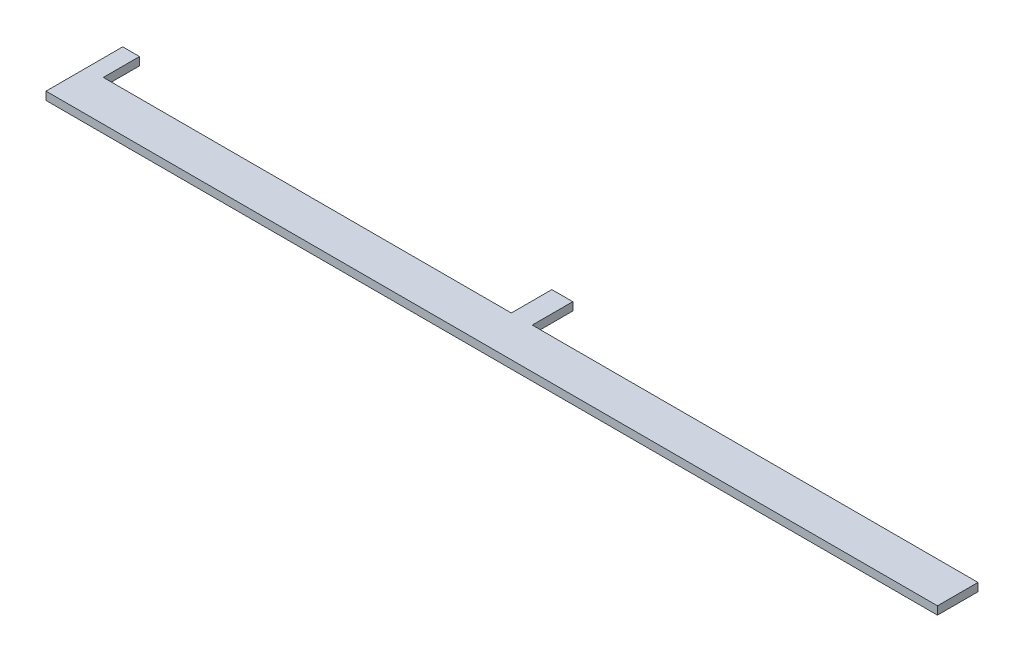
ISO-10303-21;
HEADER;
FILE_DESCRIPTION(('STEP AP214'),'2;1');
FILE_NAME('part.step','',(''),(''),'','','');
FILE_SCHEMA(('AUTOMOTIVE_DESIGN { 1 0 10303 214 1 1 1 1 }'));
ENDSEC;
DATA;
#1=APPLICATION_CONTEXT('core data for automotive mechanical design processes');
#2=APPLICATION_PROTOCOL_DEFINITION('international standard','automotive_design',2000,#1);
#3=PRODUCT_CONTEXT('',#1,'mechanical');
#4=PRODUCT('Part','Part','',(#3));
#5=PRODUCT_RELATED_PRODUCT_CATEGORY('part','',(#4));
#6=PRODUCT_DEFINITION_FORMATION('','',#4);
#7=PRODUCT_DEFINITION_CONTEXT('part definition',#1,'design');
#8=PRODUCT_DEFINITION('design','',#6,#7);
#9=PRODUCT_DEFINITION_SHAPE('','',#8);
#10=(LENGTH_UNIT() NAMED_UNIT(*) SI_UNIT(.MILLI.,.METRE.));
#11=(NAMED_UNIT(*) PLANE_ANGLE_UNIT() SI_UNIT($,.RADIAN.));
#12=(NAMED_UNIT(*) SI_UNIT($,.STERADIAN.) SOLID_ANGLE_UNIT());
#13=UNCERTAINTY_MEASURE_WITH_UNIT(LENGTH_MEASURE(1.E-05),#10,'distance_accuracy_value','');
#14=(GEOMETRIC_REPRESENTATION_CONTEXT(3) GLOBAL_UNCERTAINTY_ASSIGNED_CONTEXT((#13)) GLOBAL_UNIT_ASSIGNED_CONTEXT((#10,
#11,#12)) REPRESENTATION_CONTEXT('',''));
#15=CARTESIAN_POINT('',(0.,0.,0.));
#16=DIRECTION('',(0.,0.,1.));
#17=DIRECTION('',(1.,0.,0.));
#18=AXIS2_PLACEMENT_3D('',#15,#16,#17);
#19=CARTESIAN_POINT('',(-110.,2.,5.00000000000002));
#20=DIRECTION('',(1.,0.,0.));
#21=DIRECTION('',(0.,0.,-1.));
#22=AXIS2_PLACEMENT_3D('',#19,#20,#21);
#23=PLANE('',#22);
#24=DIRECTION('',(0.,0.,1.));
#25=VECTOR('',#24,1.);
#26=CARTESIAN_POINT('',(-110.,0.,5.00000000000002));
#27=LINE('',#26,#25);
#28=CARTESIAN_POINT('',(-110.,0.,-13.9308609903992));
#29=VERTEX_POINT('',#28);
#30=CARTESIAN_POINT('',(-110.,0.,5.00000000000002));
#31=VERTEX_POINT('',#30);
#32=EDGE_CURVE('E92',#29,#31,#27,.T.);
#33=ORIENTED_EDGE('',*,*,#32,.T.);
#34=DIRECTION('',(0.,-1.,0.));
#35=VECTOR('',#34,1.);
#36=CARTESIAN_POINT('',(-110.,2.,5.00000000000002));
#37=LINE('',#36,#35);
#38=CARTESIAN_POINT('',(-110.,2.,5.00000000000002));
#39=VERTEX_POINT('',#38);
#40=EDGE_CURVE('E11',#39,#31,#37,.T.);
#41=ORIENTED_EDGE('',*,*,#40,.F.);
#42=DIRECTION('',(0.,0.,1.));
#43=VECTOR('',#42,1.);
#44=CARTESIAN_POINT('',(-110.,2.,-4.99999999999999));
#45=LINE('',#44,#43);
#46=CARTESIAN_POINT('',(-110.,2.,-13.9308609903992));
#47=VERTEX_POINT('',#46);
#48=EDGE_CURVE('E98',#47,#39,#45,.T.);
#49=ORIENTED_EDGE('',*,*,#48,.F.);
#50=DIRECTION('',(0.,-1.,0.));
#51=VECTOR('',#50,1.);
#52=CARTESIAN_POINT('',(-110.,2.,-13.9308609903992));
#53=LINE('',#52,#51);
#54=EDGE_CURVE('E138',#47,#29,#53,.T.);
#55=ORIENTED_EDGE('',*,*,#54,.T.);
#56=EDGE_LOOP('',(#33,#41,#49,#55));
#57=FACE_BOUND('',#56,.T.);
#58=ADVANCED_FACE('F34',(#57),#23,.F.);
#59=CARTESIAN_POINT('',(110.,2.,4.99999999999999));
#60=DIRECTION('',(0.,0.,-1.));
#61=DIRECTION('',(-1.,0.,0.));
#62=AXIS2_PLACEMENT_3D('',#59,#60,#61);
#63=PLANE('',#62);
#64=DIRECTION('',(1.,0.,0.));
#65=VECTOR('',#64,1.);
#66=CARTESIAN_POINT('',(110.,0.,4.99999999999999));
#67=LINE('',#66,#65);
#68=CARTESIAN_POINT('',(110.,0.,4.99999999999999));
#69=VERTEX_POINT('',#68);
#70=EDGE_CURVE('E143',#31,#69,#67,.T.);
#71=ORIENTED_EDGE('',*,*,#70,.T.);
#72=DIRECTION('',(0.,-1.,0.));
#73=VECTOR('',#72,1.);
#74=CARTESIAN_POINT('',(110.,2.,4.99999999999999));
#75=LINE('',#74,#73);
#76=CARTESIAN_POINT('',(110.,2.,4.99999999999999));
#77=VERTEX_POINT('',#76);
#78=EDGE_CURVE('E42',#77,#69,#75,.T.);
#79=ORIENTED_EDGE('',*,*,#78,.F.);
#80=DIRECTION('',(1.,0.,0.));
#81=VECTOR('',#80,1.);
#82=CARTESIAN_POINT('',(110.,2.,4.99999999999999));
#83=LINE('',#82,#81);
#84=EDGE_CURVE('E205',#39,#77,#83,.T.);
#85=ORIENTED_EDGE('',*,*,#84,.F.);
#86=ORIENTED_EDGE('',*,*,#40,.T.);
#87=EDGE_LOOP('',(#71,#79,#85,#86));
#88=FACE_BOUND('',#87,.T.);
#89=ADVANCED_FACE('F207',(#88),#63,.F.);
#90=CARTESIAN_POINT('',(110.,2.,4.99999999999999));
#91=DIRECTION('',(-1.,0.,0.));
#92=DIRECTION('',(0.,0.,1.));
#93=AXIS2_PLACEMENT_3D('',#90,#91,#92);
#94=PLANE('',#93);
#95=DIRECTION('',(0.,0.,-1.));
#96=VECTOR('',#95,1.);
#97=CARTESIAN_POINT('',(110.,0.,4.99999999999999));
#98=LINE('',#97,#96);
#99=CARTESIAN_POINT('',(110.,0.,-5.00000000000001));
#100=VERTEX_POINT('',#99);
#101=EDGE_CURVE('E145',#69,#100,#98,.T.);
#102=ORIENTED_EDGE('',*,*,#101,.T.);
#103=DIRECTION('',(0.,-1.,0.));
#104=VECTOR('',#103,1.);
#105=CARTESIAN_POINT('',(110.,2.,-5.00000000000001));
#106=LINE('',#105,#104);
#107=CARTESIAN_POINT('',(110.,2.,-5.00000000000001));
#108=VERTEX_POINT('',#107);
#109=EDGE_CURVE('E172',#108,#100,#106,.T.);
#110=ORIENTED_EDGE('',*,*,#109,.F.);
#111=DIRECTION('',(0.,0.,-1.));
#112=VECTOR('',#111,1.);
#113=CARTESIAN_POINT('',(110.,2.,4.99999999999999));
#114=LINE('',#113,#112);
#115=EDGE_CURVE('E181',#77,#108,#114,.T.);
#116=ORIENTED_EDGE('',*,*,#115,.F.);
#117=ORIENTED_EDGE('',*,*,#78,.T.);
#118=EDGE_LOOP('',(#102,#110,#116,#117));
#119=FACE_BOUND('',#118,.T.);
#120=ADVANCED_FACE('F179',(#119),#94,.F.);
#121=CARTESIAN_POINT('',(110.,2.,-5.00000000000001));
#122=DIRECTION('',(0.,0.,1.));
#123=DIRECTION('',(1.,0.,0.));
#124=AXIS2_PLACEMENT_3D('',#121,#122,#123);
#125=PLANE('',#124);
#126=DIRECTION('',(-1.,0.,0.));
#127=VECTOR('',#126,1.);
#128=CARTESIAN_POINT('',(110.,0.,-5.00000000000001));
#129=LINE('',#128,#127);
#130=CARTESIAN_POINT('',(0.,0.,-5.));
#131=VERTEX_POINT('',#130);
#132=EDGE_CURVE('E147',#100,#131,#129,.T.);
#133=ORIENTED_EDGE('',*,*,#132,.T.);
#134=DIRECTION('',(0.,-1.,0.));
#135=VECTOR('',#134,1.);
#136=CARTESIAN_POINT('',(0.,2.,-5.));
#137=LINE('',#136,#135);
#138=CARTESIAN_POINT('',(0.,2.,-5.));
#139=VERTEX_POINT('',#138);
#140=EDGE_CURVE('E169',#139,#131,#137,.T.);
#141=ORIENTED_EDGE('',*,*,#140,.F.);
#142=DIRECTION('',(-1.,0.,0.));
#143=VECTOR('',#142,1.);
#144=CARTESIAN_POINT('',(110.,2.,-5.00000000000001));
#145=LINE('',#144,#143);
#146=EDGE_CURVE('E199',#108,#139,#145,.T.);
#147=ORIENTED_EDGE('',*,*,#146,.F.);
#148=ORIENTED_EDGE('',*,*,#109,.T.);
#149=EDGE_LOOP('',(#133,#141,#147,#148));
#150=FACE_BOUND('',#149,.T.);
#151=ADVANCED_FACE('F190',(#150),#125,.F.);
#152=CARTESIAN_POINT('',(0.,2.,-15.));
#153=DIRECTION('',(-1.,0.,0.));
#154=DIRECTION('',(0.,0.,1.));
#155=AXIS2_PLACEMENT_3D('',#152,#153,#154);
#156=PLANE('',#155);
#157=DIRECTION('',(0.,0.,-1.));
#158=VECTOR('',#157,1.);
#159=CARTESIAN_POINT('',(0.,0.,-15.));
#160=LINE('',#159,#158);
#161=CARTESIAN_POINT('',(0.,0.,-15.));
#162=VERTEX_POINT('',#161);
#163=EDGE_CURVE('E149',#131,#162,#160,.T.);
#164=ORIENTED_EDGE('',*,*,#163,.T.);
#165=DIRECTION('',(0.,-1.,0.));
#166=VECTOR('',#165,1.);
#167=CARTESIAN_POINT('',(0.,2.,-15.));
#168=LINE('',#167,#166);
#169=CARTESIAN_POINT('',(0.,2.,-15.));
#170=VERTEX_POINT('',#169);
#171=EDGE_CURVE('E166',#170,#162,#168,.T.);
#172=ORIENTED_EDGE('',*,*,#171,.F.);
#173=DIRECTION('',(0.,0.,-1.));
#174=VECTOR('',#173,1.);
#175=CARTESIAN_POINT('',(0.,2.,-15.));
#176=LINE('',#175,#174);
#177=EDGE_CURVE('E196',#139,#170,#176,.T.);
#178=ORIENTED_EDGE('',*,*,#177,.F.);
#179=ORIENTED_EDGE('',*,*,#140,.T.);
#180=EDGE_LOOP('',(#164,#172,#178,#179));
#181=FACE_BOUND('',#180,.T.);
#182=ADVANCED_FACE('F194',(#181),#156,.F.);
#183=CARTESIAN_POINT('',(-5.16486552938202,2.,-15.));
#184=DIRECTION('',(0.,0.,1.));
#185=DIRECTION('',(1.,0.,0.));
#186=AXIS2_PLACEMENT_3D('',#183,#184,#185);
#187=PLANE('',#186);
#188=DIRECTION('',(-1.,0.,0.));
#189=VECTOR('',#188,1.);
#190=CARTESIAN_POINT('',(-5.16486552938202,0.,-15.));
#191=LINE('',#190,#189);
#192=CARTESIAN_POINT('',(-5.16486552938202,0.,-15.));
#193=VERTEX_POINT('',#192);
#194=EDGE_CURVE('E151',#162,#193,#191,.T.);
#195=ORIENTED_EDGE('',*,*,#194,.T.);
#196=DIRECTION('',(0.,-1.,0.));
#197=VECTOR('',#196,1.);
#198=CARTESIAN_POINT('',(-5.16486552938202,2.,-15.));
#199=LINE('',#198,#197);
#200=CARTESIAN_POINT('',(-5.16486552938202,2.,-15.));
#201=VERTEX_POINT('',#200);
#202=EDGE_CURVE('E163',#201,#193,#199,.T.);
#203=ORIENTED_EDGE('',*,*,#202,.F.);
#204=DIRECTION('',(-1.,0.,0.));
#205=VECTOR('',#204,1.);
#206=CARTESIAN_POINT('',(-5.16486552938202,2.,-15.));
#207=LINE('',#206,#205);
#208=EDGE_CURVE('E198',#170,#201,#207,.T.);
#209=ORIENTED_EDGE('',*,*,#208,.F.);
#210=ORIENTED_EDGE('',*,*,#171,.T.);
#211=EDGE_LOOP('',(#195,#203,#209,#210));
#212=FACE_BOUND('',#211,.T.);
#213=ADVANCED_FACE('F216',(#212),#187,.F.);
#214=CARTESIAN_POINT('',(-5.16486552938202,2.,-5.));
#215=DIRECTION('',(1.,0.,0.));
#216=DIRECTION('',(0.,0.,-1.));
#217=AXIS2_PLACEMENT_3D('',#214,#215,#216);
#218=PLANE('',#217);
#219=DIRECTION('',(0.,0.,1.));
#220=VECTOR('',#219,1.);
#221=CARTESIAN_POINT('',(-5.16486552938202,0.,-5.));
#222=LINE('',#221,#220);
#223=CARTESIAN_POINT('',(-5.16486552938202,0.,-5.));
#224=VERTEX_POINT('',#223);
#225=EDGE_CURVE('E153',#193,#224,#222,.T.);
#226=ORIENTED_EDGE('',*,*,#225,.T.);
#227=DIRECTION('',(0.,-1.,0.));
#228=VECTOR('',#227,1.);
#229=CARTESIAN_POINT('',(-5.16486552938202,2.,-5.));
#230=LINE('',#229,#228);
#231=CARTESIAN_POINT('',(-5.16486552938202,2.,-5.));
#232=VERTEX_POINT('',#231);
#233=EDGE_CURVE('E133',#232,#224,#230,.T.);
#234=ORIENTED_EDGE('',*,*,#233,.F.);
#235=DIRECTION('',(0.,0.,1.));
#236=VECTOR('',#235,1.);
#237=CARTESIAN_POINT('',(-5.16486552938202,2.,-5.));
#238=LINE('',#237,#236);
#239=EDGE_CURVE('E124',#201,#232,#238,.T.);
#240=ORIENTED_EDGE('',*,*,#239,.F.);
#241=ORIENTED_EDGE('',*,*,#202,.T.);
#242=EDGE_LOOP('',(#226,#234,#240,#241));
#243=FACE_BOUND('',#242,.T.);
#244=ADVANCED_FACE('F213',(#243),#218,.F.);
#245=CARTESIAN_POINT('',(-5.16486552938202,2.,-5.));
#246=DIRECTION('',(0.,0.,1.));
#247=DIRECTION('',(1.,0.,0.));
#248=AXIS2_PLACEMENT_3D('',#245,#246,#247);
#249=PLANE('',#248);
#250=DIRECTION('',(-1.,0.,0.));
#251=VECTOR('',#250,1.);
#252=CARTESIAN_POINT('',(-5.16486552938202,0.,-5.));
#253=LINE('',#252,#251);
#254=CARTESIAN_POINT('',(-105.853581382178,0.,-4.99999999999999));
#255=VERTEX_POINT('',#254);
#256=EDGE_CURVE('E132',#224,#255,#253,.T.);
#257=ORIENTED_EDGE('',*,*,#256,.T.);
#258=DIRECTION('',(0.,-1.,0.));
#259=VECTOR('',#258,1.);
#260=CARTESIAN_POINT('',(-105.853581382178,2.,-4.99999999999999));
#261=LINE('',#260,#259);
#262=CARTESIAN_POINT('',(-105.853581382178,2.,-4.99999999999999));
#263=VERTEX_POINT('',#262);
#264=EDGE_CURVE('E129',#263,#255,#261,.T.);
#265=ORIENTED_EDGE('',*,*,#264,.F.);
#266=DIRECTION('',(-1.,0.,0.));
#267=VECTOR('',#266,1.);
#268=CARTESIAN_POINT('',(-5.16486552938202,2.,-5.));
#269=LINE('',#268,#267);
#270=EDGE_CURVE('E118',#232,#263,#269,.T.);
#271=ORIENTED_EDGE('',*,*,#270,.F.);
#272=ORIENTED_EDGE('',*,*,#233,.T.);
#273=EDGE_LOOP('',(#257,#265,#271,#272));
#274=FACE_BOUND('',#273,.T.);
#275=ADVANCED_FACE('F130',(#274),#249,.F.);
#276=CARTESIAN_POINT('',(-105.853581382178,2.,-13.9308609903992));
#277=DIRECTION('',(-1.,0.,0.));
#278=DIRECTION('',(0.,0.,1.));
#279=AXIS2_PLACEMENT_3D('',#276,#277,#278);
#280=PLANE('',#279);
#281=DIRECTION('',(0.,0.,-1.));
#282=VECTOR('',#281,1.);
#283=CARTESIAN_POINT('',(-105.853581382178,0.,-13.9308609903992));
#284=LINE('',#283,#282);
#285=CARTESIAN_POINT('',(-105.853581382178,0.,-13.9308609903992));
#286=VERTEX_POINT('',#285);
#287=EDGE_CURVE('E85',#255,#286,#284,.T.);
#288=ORIENTED_EDGE('',*,*,#287,.T.);
#289=DIRECTION('',(0.,-1.,0.));
#290=VECTOR('',#289,1.);
#291=CARTESIAN_POINT('',(-105.853581382178,2.,-13.9308609903992));
#292=LINE('',#291,#290);
#293=CARTESIAN_POINT('',(-105.853581382178,2.,-13.9308609903992));
#294=VERTEX_POINT('',#293);
#295=EDGE_CURVE('E134',#294,#286,#292,.T.);
#296=ORIENTED_EDGE('',*,*,#295,.F.);
#297=DIRECTION('',(0.,0.,-1.));
#298=VECTOR('',#297,1.);
#299=CARTESIAN_POINT('',(-105.853581382178,2.,-13.9308609903992));
#300=LINE('',#299,#298);
#301=EDGE_CURVE('E122',#263,#294,#300,.T.);
#302=ORIENTED_EDGE('',*,*,#301,.F.);
#303=ORIENTED_EDGE('',*,*,#264,.T.);
#304=EDGE_LOOP('',(#288,#296,#302,#303));
#305=FACE_BOUND('',#304,.T.);
#306=ADVANCED_FACE('F136',(#305),#280,.F.);
#307=CARTESIAN_POINT('',(-110.,2.,-13.9308609903992));
#308=DIRECTION('',(0.,0.,1.));
#309=DIRECTION('',(1.,0.,0.));
#310=AXIS2_PLACEMENT_3D('',#307,#308,#309);
#311=PLANE('',#310);
#312=DIRECTION('',(-1.,0.,0.));
#313=VECTOR('',#312,1.);
#314=CARTESIAN_POINT('',(-110.,0.,-13.9308609903992));
#315=LINE('',#314,#313);
#316=EDGE_CURVE('E157',#286,#29,#315,.T.);
#317=ORIENTED_EDGE('',*,*,#316,.T.);
#318=ORIENTED_EDGE('',*,*,#54,.F.);
#319=DIRECTION('',(-1.,0.,0.));
#320=VECTOR('',#319,1.);
#321=CARTESIAN_POINT('',(-110.,2.,-13.9308609903992));
#322=LINE('',#321,#320);
#323=EDGE_CURVE('E50',#294,#47,#322,.T.);
#324=ORIENTED_EDGE('',*,*,#323,.F.);
#325=ORIENTED_EDGE('',*,*,#295,.T.);
#326=EDGE_LOOP('',(#317,#318,#324,#325));
#327=FACE_BOUND('',#326,.T.);
#328=ADVANCED_FACE('F210',(#327),#311,.F.);
#329=CARTESIAN_POINT('',(0.,2.,0.));
#330=DIRECTION('',(0.,-1.,0.));
#331=DIRECTION('',(0.,0.,-1.));
#332=AXIS2_PLACEMENT_3D('',#329,#330,#331);
#333=PLANE('',#332);
#334=ORIENTED_EDGE('',*,*,#48,.T.);
#335=ORIENTED_EDGE('',*,*,#84,.T.);
#336=ORIENTED_EDGE('',*,*,#115,.T.);
#337=ORIENTED_EDGE('',*,*,#146,.T.);
#338=ORIENTED_EDGE('',*,*,#177,.T.);
#339=ORIENTED_EDGE('',*,*,#208,.T.);
#340=ORIENTED_EDGE('',*,*,#239,.T.);
#341=ORIENTED_EDGE('',*,*,#270,.T.);
#342=ORIENTED_EDGE('',*,*,#301,.T.);
#343=ORIENTED_EDGE('',*,*,#323,.T.);
#344=EDGE_LOOP('',(#334,#335,#336,#337,#338,#339,#340,#341,#342,#343));
#345=FACE_BOUND('',#344,.T.);
#346=ADVANCED_FACE('F120',(#345),#333,.F.);
#347=CARTESIAN_POINT('',(0.,0.,0.));
#348=DIRECTION('',(0.,-1.,0.));
#349=DIRECTION('',(0.,0.,-1.));
#350=AXIS2_PLACEMENT_3D('',#347,#348,#349);
#351=PLANE('',#350);
#352=ORIENTED_EDGE('',*,*,#32,.F.);
#353=ORIENTED_EDGE('',*,*,#316,.F.);
#354=ORIENTED_EDGE('',*,*,#287,.F.);
#355=ORIENTED_EDGE('',*,*,#256,.F.);
#356=ORIENTED_EDGE('',*,*,#225,.F.);
#357=ORIENTED_EDGE('',*,*,#194,.F.);
#358=ORIENTED_EDGE('',*,*,#163,.F.);
#359=ORIENTED_EDGE('',*,*,#132,.F.);
#360=ORIENTED_EDGE('',*,*,#101,.F.);
#361=ORIENTED_EDGE('',*,*,#70,.F.);
#362=EDGE_LOOP('',(#352,#353,#354,#355,#356,#357,#358,#359,#360,#361));
#363=FACE_BOUND('',#362,.T.);
#364=ADVANCED_FACE('F185',(#363),#351,.T.);
#365=CLOSED_SHELL('',(#58,#89,#120,#151,#182,#213,#244,#275,#306,#328,#346,#364));
#366=MANIFOLD_SOLID_BREP('B2',#365);
#367=ADVANCED_BREP_SHAPE_REPRESENTATION('',(#18,#366),#14);
#368=SHAPE_DEFINITION_REPRESENTATION(#9,#367);
ENDSEC;
END-ISO-10303-21;
